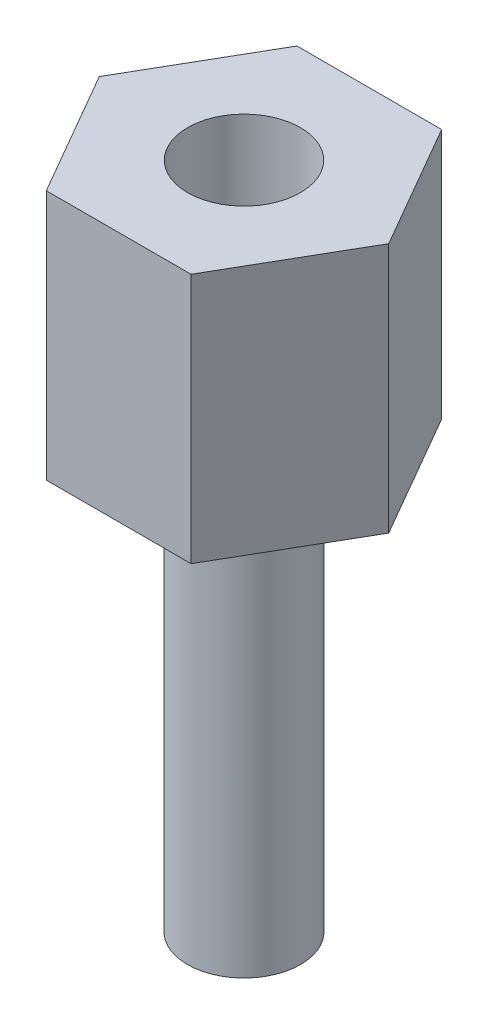
ISO-10303-21;
HEADER;
FILE_DESCRIPTION(('STEP AP214'),'2;1');
FILE_NAME('part.step','',(''),(''),'','','');
FILE_SCHEMA(('AUTOMOTIVE_DESIGN { 1 0 10303 214 1 1 1 1 }'));
ENDSEC;
DATA;
#1=APPLICATION_CONTEXT('core data for automotive mechanical design processes');
#2=APPLICATION_PROTOCOL_DEFINITION('international standard','automotive_design',2000,#1);
#3=PRODUCT_CONTEXT('',#1,'mechanical');
#4=PRODUCT('Part','Part','',(#3));
#5=PRODUCT_RELATED_PRODUCT_CATEGORY('part','',(#4));
#6=PRODUCT_DEFINITION_FORMATION('','',#4);
#7=PRODUCT_DEFINITION_CONTEXT('part definition',#1,'design');
#8=PRODUCT_DEFINITION('design','',#6,#7);
#9=PRODUCT_DEFINITION_SHAPE('','',#8);
#10=(LENGTH_UNIT() NAMED_UNIT(*) SI_UNIT(.MILLI.,.METRE.));
#11=(NAMED_UNIT(*) PLANE_ANGLE_UNIT() SI_UNIT($,.RADIAN.));
#12=(NAMED_UNIT(*) SI_UNIT($,.STERADIAN.) SOLID_ANGLE_UNIT());
#13=UNCERTAINTY_MEASURE_WITH_UNIT(LENGTH_MEASURE(1.E-05),#10,'distance_accuracy_value','');
#14=(GEOMETRIC_REPRESENTATION_CONTEXT(3) GLOBAL_UNCERTAINTY_ASSIGNED_CONTEXT((#13)) GLOBAL_UNIT_ASSIGNED_CONTEXT((#10,
#11,#12)) REPRESENTATION_CONTEXT('',''));
#15=CARTESIAN_POINT('',(0.,0.,0.));
#16=DIRECTION('',(0.,0.,1.));
#17=DIRECTION('',(1.,0.,0.));
#18=AXIS2_PLACEMENT_3D('',#15,#16,#17);
#19=CARTESIAN_POINT('',(1.73205080756888,6.,3.));
#20=DIRECTION('',(-0.866025403784439,0.,-0.5));
#21=DIRECTION('',(-0.5,0.,0.866025403784439));
#22=AXIS2_PLACEMENT_3D('',#19,#20,#21);
#23=PLANE('',#22);
#24=DIRECTION('',(0.5,0.,-0.866025403784439));
#25=VECTOR('',#24,1.);
#26=CARTESIAN_POINT('',(1.73205080756888,0.,3.));
#27=LINE('',#26,#25);
#28=CARTESIAN_POINT('',(1.73205080756888,0.,3.));
#29=VERTEX_POINT('',#28);
#30=CARTESIAN_POINT('',(3.46410161513776,0.,0.));
#31=VERTEX_POINT('',#30);
#32=EDGE_CURVE('E118',#29,#31,#27,.T.);
#33=ORIENTED_EDGE('',*,*,#32,.T.);
#34=DIRECTION('',(0.,-1.,0.));
#35=VECTOR('',#34,1.);
#36=CARTESIAN_POINT('',(3.46410161513776,6.,0.));
#37=LINE('',#36,#35);
#38=CARTESIAN_POINT('',(3.46410161513776,6.,0.));
#39=VERTEX_POINT('',#38);
#40=EDGE_CURVE('E41',#39,#31,#37,.T.);
#41=ORIENTED_EDGE('',*,*,#40,.F.);
#42=DIRECTION('',(0.5,0.,-0.866025403784439));
#43=VECTOR('',#42,1.);
#44=CARTESIAN_POINT('',(1.73205080756888,6.,3.));
#45=LINE('',#44,#43);
#46=CARTESIAN_POINT('',(1.73205080756888,6.,3.));
#47=VERTEX_POINT('',#46);
#48=EDGE_CURVE('E129',#47,#39,#45,.T.);
#49=ORIENTED_EDGE('',*,*,#48,.F.);
#50=DIRECTION('',(0.,-1.,0.));
#51=VECTOR('',#50,1.);
#52=CARTESIAN_POINT('',(1.73205080756888,6.,3.));
#53=LINE('',#52,#51);
#54=EDGE_CURVE('E114',#47,#29,#53,.T.);
#55=ORIENTED_EDGE('',*,*,#54,.T.);
#56=EDGE_LOOP('',(#33,#41,#49,#55));
#57=FACE_BOUND('',#56,.T.);
#58=ADVANCED_FACE('F33',(#57),#23,.F.);
#59=CARTESIAN_POINT('',(3.46410161513776,6.,0.));
#60=DIRECTION('',(-0.866025403784438,0.,0.5));
#61=DIRECTION('',(0.5,0.,0.866025403784439));
#62=AXIS2_PLACEMENT_3D('',#59,#60,#61);
#63=PLANE('',#62);
#64=DIRECTION('',(-0.5,0.,-0.866025403784439));
#65=VECTOR('',#64,1.);
#66=CARTESIAN_POINT('',(3.46410161513776,0.,0.));
#67=LINE('',#66,#65);
#68=CARTESIAN_POINT('',(1.73205080756888,0.,-3.));
#69=VERTEX_POINT('',#68);
#70=EDGE_CURVE('E121',#31,#69,#67,.T.);
#71=ORIENTED_EDGE('',*,*,#70,.T.);
#72=DIRECTION('',(0.,-1.,0.));
#73=VECTOR('',#72,1.);
#74=CARTESIAN_POINT('',(1.73205080756888,6.,-3.));
#75=LINE('',#74,#73);
#76=CARTESIAN_POINT('',(1.73205080756888,6.,-3.));
#77=VERTEX_POINT('',#76);
#78=EDGE_CURVE('E133',#77,#69,#75,.T.);
#79=ORIENTED_EDGE('',*,*,#78,.F.);
#80=DIRECTION('',(-0.5,0.,-0.866025403784439));
#81=VECTOR('',#80,1.);
#82=CARTESIAN_POINT('',(3.46410161513776,6.,0.));
#83=LINE('',#82,#81);
#84=EDGE_CURVE('E87',#39,#77,#83,.T.);
#85=ORIENTED_EDGE('',*,*,#84,.F.);
#86=ORIENTED_EDGE('',*,*,#40,.T.);
#87=EDGE_LOOP('',(#71,#79,#85,#86));
#88=FACE_BOUND('',#87,.T.);
#89=ADVANCED_FACE('F136',(#88),#63,.F.);
#90=CARTESIAN_POINT('',(1.73205080756888,6.,-3.));
#91=DIRECTION('',(0.,0.,1.));
#92=DIRECTION('',(1.,0.,0.));
#93=AXIS2_PLACEMENT_3D('',#90,#91,#92);
#94=PLANE('',#93);
#95=DIRECTION('',(-1.,0.,0.));
#96=VECTOR('',#95,1.);
#97=CARTESIAN_POINT('',(1.73205080756888,0.,-3.));
#98=LINE('',#97,#96);
#99=CARTESIAN_POINT('',(-1.73205080756888,0.,-3.));
#100=VERTEX_POINT('',#99);
#101=EDGE_CURVE('E124',#69,#100,#98,.T.);
#102=ORIENTED_EDGE('',*,*,#101,.T.);
#103=DIRECTION('',(0.,-1.,0.));
#104=VECTOR('',#103,1.);
#105=CARTESIAN_POINT('',(-1.73205080756888,6.,-3.));
#106=LINE('',#105,#104);
#107=CARTESIAN_POINT('',(-1.73205080756888,6.,-3.));
#108=VERTEX_POINT('',#107);
#109=EDGE_CURVE('E109',#108,#100,#106,.T.);
#110=ORIENTED_EDGE('',*,*,#109,.F.);
#111=DIRECTION('',(-1.,0.,0.));
#112=VECTOR('',#111,1.);
#113=CARTESIAN_POINT('',(1.73205080756888,6.,-3.));
#114=LINE('',#113,#112);
#115=EDGE_CURVE('E100',#77,#108,#114,.T.);
#116=ORIENTED_EDGE('',*,*,#115,.F.);
#117=ORIENTED_EDGE('',*,*,#78,.T.);
#118=EDGE_LOOP('',(#102,#110,#116,#117));
#119=FACE_BOUND('',#118,.T.);
#120=ADVANCED_FACE('F144',(#119),#94,.F.);
#121=CARTESIAN_POINT('',(-1.73205080756888,6.,-3.));
#122=DIRECTION('',(0.866025403784439,0.,0.5));
#123=DIRECTION('',(0.5,0.,-0.866025403784439));
#124=AXIS2_PLACEMENT_3D('',#121,#122,#123);
#125=PLANE('',#124);
#126=DIRECTION('',(-0.5,0.,0.866025403784439));
#127=VECTOR('',#126,1.);
#128=CARTESIAN_POINT('',(-1.73205080756888,0.,-3.));
#129=LINE('',#128,#127);
#130=CARTESIAN_POINT('',(-3.46410161513776,0.,0.));
#131=VERTEX_POINT('',#130);
#132=EDGE_CURVE('E108',#100,#131,#129,.T.);
#133=ORIENTED_EDGE('',*,*,#132,.T.);
#134=DIRECTION('',(0.,-1.,0.));
#135=VECTOR('',#134,1.);
#136=CARTESIAN_POINT('',(-3.46410161513776,6.,0.));
#137=LINE('',#136,#135);
#138=CARTESIAN_POINT('',(-3.46410161513776,6.,0.));
#139=VERTEX_POINT('',#138);
#140=EDGE_CURVE('E105',#139,#131,#137,.T.);
#141=ORIENTED_EDGE('',*,*,#140,.F.);
#142=DIRECTION('',(-0.5,0.,0.866025403784439));
#143=VECTOR('',#142,1.);
#144=CARTESIAN_POINT('',(-1.73205080756888,6.,-3.));
#145=LINE('',#144,#143);
#146=EDGE_CURVE('E94',#108,#139,#145,.T.);
#147=ORIENTED_EDGE('',*,*,#146,.F.);
#148=ORIENTED_EDGE('',*,*,#109,.T.);
#149=EDGE_LOOP('',(#133,#141,#147,#148));
#150=FACE_BOUND('',#149,.T.);
#151=ADVANCED_FACE('F106',(#150),#125,.F.);
#152=CARTESIAN_POINT('',(-3.46410161513776,6.,0.));
#153=DIRECTION('',(0.866025403784439,0.,-0.5));
#154=DIRECTION('',(-0.5,0.,-0.866025403784439));
#155=AXIS2_PLACEMENT_3D('',#152,#153,#154);
#156=PLANE('',#155);
#157=DIRECTION('',(0.5,0.,0.866025403784438));
#158=VECTOR('',#157,1.);
#159=CARTESIAN_POINT('',(-3.46410161513776,0.,0.));
#160=LINE('',#159,#158);
#161=CARTESIAN_POINT('',(-1.73205080756888,0.,3.));
#162=VERTEX_POINT('',#161);
#163=EDGE_CURVE('E72',#131,#162,#160,.T.);
#164=ORIENTED_EDGE('',*,*,#163,.T.);
#165=DIRECTION('',(0.,-1.,0.));
#166=VECTOR('',#165,1.);
#167=CARTESIAN_POINT('',(-1.73205080756888,6.,3.));
#168=LINE('',#167,#166);
#169=CARTESIAN_POINT('',(-1.73205080756888,6.,3.));
#170=VERTEX_POINT('',#169);
#171=EDGE_CURVE('E110',#170,#162,#168,.T.);
#172=ORIENTED_EDGE('',*,*,#171,.F.);
#173=DIRECTION('',(0.5,0.,0.866025403784438));
#174=VECTOR('',#173,1.);
#175=CARTESIAN_POINT('',(-3.46410161513776,6.,0.));
#176=LINE('',#175,#174);
#177=EDGE_CURVE('E98',#139,#170,#176,.T.);
#178=ORIENTED_EDGE('',*,*,#177,.F.);
#179=ORIENTED_EDGE('',*,*,#140,.T.);
#180=EDGE_LOOP('',(#164,#172,#178,#179));
#181=FACE_BOUND('',#180,.T.);
#182=ADVANCED_FACE('F112',(#181),#156,.F.);
#183=CARTESIAN_POINT('',(-1.73205080756888,6.,3.));
#184=DIRECTION('',(0.,0.,-1.));
#185=DIRECTION('',(-1.,0.,0.));
#186=AXIS2_PLACEMENT_3D('',#183,#184,#185);
#187=PLANE('',#186);
#188=DIRECTION('',(1.,0.,0.));
#189=VECTOR('',#188,1.);
#190=CARTESIAN_POINT('',(-1.73205080756888,0.,3.));
#191=LINE('',#190,#189);
#192=EDGE_CURVE('E78',#162,#29,#191,.T.);
#193=ORIENTED_EDGE('',*,*,#192,.T.);
#194=ORIENTED_EDGE('',*,*,#54,.F.);
#195=DIRECTION('',(1.,0.,0.));
#196=VECTOR('',#195,1.);
#197=CARTESIAN_POINT('',(-1.73205080756888,6.,3.));
#198=LINE('',#197,#196);
#199=EDGE_CURVE('E49',#170,#47,#198,.T.);
#200=ORIENTED_EDGE('',*,*,#199,.F.);
#201=ORIENTED_EDGE('',*,*,#171,.T.);
#202=EDGE_LOOP('',(#193,#194,#200,#201));
#203=FACE_BOUND('',#202,.T.);
#204=ADVANCED_FACE('F167',(#203),#187,.F.);
#205=CARTESIAN_POINT('',(0.,6.,0.));
#206=DIRECTION('',(0.,1.,0.));
#207=DIRECTION('',(0.,0.,1.));
#208=AXIS2_PLACEMENT_3D('',#205,#206,#207);
#209=PLANE('',#208);
#210=CARTESIAN_POINT('',(0.,6.,0.));
#211=DIRECTION('',(0.,1.,0.));
#212=DIRECTION('',(0.,0.,1.));
#213=AXIS2_PLACEMENT_3D('',#210,#211,#212);
#214=CIRCLE('',#213,1.35);
#215=CARTESIAN_POINT('',(0.,6.,1.35));
#216=VERTEX_POINT('',#215);
#217=EDGE_CURVE('E151',#216,#216,#214,.T.);
#218=ORIENTED_EDGE('',*,*,#217,.F.);
#219=EDGE_LOOP('',(#218));
#220=FACE_BOUND('',#219,.T.);
#221=ORIENTED_EDGE('',*,*,#48,.T.);
#222=ORIENTED_EDGE('',*,*,#84,.T.);
#223=ORIENTED_EDGE('',*,*,#115,.T.);
#224=ORIENTED_EDGE('',*,*,#146,.T.);
#225=ORIENTED_EDGE('',*,*,#177,.T.);
#226=ORIENTED_EDGE('',*,*,#199,.T.);
#227=EDGE_LOOP('',(#221,#222,#223,#224,#225,#226));
#228=FACE_BOUND('',#227,.T.);
#229=ADVANCED_FACE('F96',(#220,#228),#209,.T.);
#230=CARTESIAN_POINT('',(0.,0.,0.));
#231=DIRECTION('',(0.,1.,0.));
#232=DIRECTION('',(0.,0.,1.));
#233=AXIS2_PLACEMENT_3D('',#230,#231,#232);
#234=PLANE('',#233);
#235=CARTESIAN_POINT('',(0.,0.,0.));
#236=DIRECTION('',(0.,1.,0.));
#237=DIRECTION('',(0.,0.,1.));
#238=AXIS2_PLACEMENT_3D('',#235,#236,#237);
#239=CIRCLE('',#238,1.3538379591145);
#240=CARTESIAN_POINT('',(0.,0.,1.3538379591145));
#241=VERTEX_POINT('',#240);
#242=EDGE_CURVE('E11',#241,#241,#239,.F.);
#243=ORIENTED_EDGE('',*,*,#242,.F.);
#244=EDGE_LOOP('',(#243));
#245=FACE_BOUND('',#244,.T.);
#246=ORIENTED_EDGE('',*,*,#32,.F.);
#247=ORIENTED_EDGE('',*,*,#192,.F.);
#248=ORIENTED_EDGE('',*,*,#163,.F.);
#249=ORIENTED_EDGE('',*,*,#132,.F.);
#250=ORIENTED_EDGE('',*,*,#101,.F.);
#251=ORIENTED_EDGE('',*,*,#70,.F.);
#252=EDGE_LOOP('',(#246,#247,#248,#249,#250,#251));
#253=FACE_BOUND('',#252,.T.);
#254=ADVANCED_FACE('F141',(#245,#253),#234,.F.);
#255=CARTESIAN_POINT('',(0.,-10.,0.));
#256=DIRECTION('',(0.,1.,0.));
#257=DIRECTION('',(0.,0.,1.));
#258=AXIS2_PLACEMENT_3D('',#255,#256,#257);
#259=CYLINDRICAL_SURFACE('',#258,1.3538379591145);
#260=CARTESIAN_POINT('',(0.,-10.,0.));
#261=DIRECTION('',(0.,-1.,0.));
#262=DIRECTION('',(0.,0.,-1.));
#263=AXIS2_PLACEMENT_3D('',#260,#261,#262);
#264=CIRCLE('',#263,1.3538379591145);
#265=CARTESIAN_POINT('',(0.,-10.,-1.3538379591145));
#266=VERTEX_POINT('',#265);
#267=EDGE_CURVE('E122',#266,#266,#264,.T.);
#268=ORIENTED_EDGE('',*,*,#267,.F.);
#269=EDGE_LOOP('',(#268));
#270=FACE_BOUND('',#269,.T.);
#271=ORIENTED_EDGE('',*,*,#242,.T.);
#272=EDGE_LOOP('',(#271));
#273=FACE_BOUND('',#272,.T.);
#274=ADVANCED_FACE('F174',(#270,#273),#259,.T.);
#275=CARTESIAN_POINT('',(0.,-10.,0.));
#276=DIRECTION('',(0.,-1.,0.));
#277=DIRECTION('',(0.,0.,-1.));
#278=AXIS2_PLACEMENT_3D('',#275,#276,#277);
#279=PLANE('',#278);
#280=ORIENTED_EDGE('',*,*,#267,.T.);
#281=EDGE_LOOP('',(#280));
#282=FACE_BOUND('',#281,.T.);
#283=ADVANCED_FACE('F162',(#282),#279,.T.);
#284=CARTESIAN_POINT('',(0.,1.,0.));
#285=DIRECTION('',(0.,1.,0.));
#286=DIRECTION('',(0.,0.,1.));
#287=AXIS2_PLACEMENT_3D('',#284,#285,#286);
#288=CYLINDRICAL_SURFACE('',#287,1.35);
#289=CARTESIAN_POINT('',(0.,1.,0.));
#290=DIRECTION('',(0.,1.,0.));
#291=DIRECTION('',(0.,0.,1.));
#292=AXIS2_PLACEMENT_3D('',#289,#290,#291);
#293=CIRCLE('',#292,1.35);
#294=CARTESIAN_POINT('',(0.,1.,1.35));
#295=VERTEX_POINT('',#294);
#296=EDGE_CURVE('E150',#295,#295,#293,.T.);
#297=ORIENTED_EDGE('',*,*,#296,.F.);
#298=EDGE_LOOP('',(#297));
#299=FACE_BOUND('',#298,.T.);
#300=ORIENTED_EDGE('',*,*,#217,.T.);
#301=EDGE_LOOP('',(#300));
#302=FACE_BOUND('',#301,.T.);
#303=ADVANCED_FACE('F159',(#299,#302),#288,.F.);
#304=CARTESIAN_POINT('',(0.,1.,0.));
#305=DIRECTION('',(0.,1.,0.));
#306=DIRECTION('',(0.,0.,1.));
#307=AXIS2_PLACEMENT_3D('',#304,#305,#306);
#308=PLANE('',#307);
#309=ORIENTED_EDGE('',*,*,#296,.T.);
#310=EDGE_LOOP('',(#309));
#311=FACE_BOUND('',#310,.T.);
#312=ADVANCED_FACE('F157',(#311),#308,.T.);
#313=CLOSED_SHELL('',(#58,#89,#120,#151,#182,#204,#229,#254,#274,#283,#303,#312));
#314=MANIFOLD_SOLID_BREP('B2',#313);
#315=ADVANCED_BREP_SHAPE_REPRESENTATION('',(#18,#314),#14);
#316=SHAPE_DEFINITION_REPRESENTATION(#9,#315);
ENDSEC;
END-ISO-10303-21;
